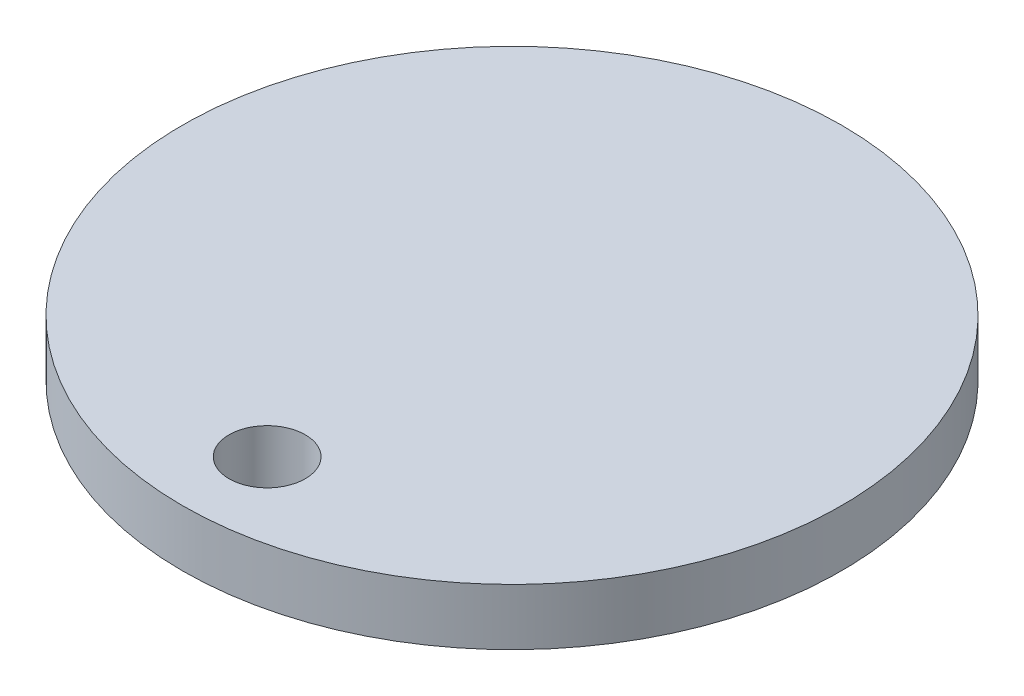
ISO-10303-21;
HEADER;
FILE_DESCRIPTION(('STEP AP214'),'2;1');
FILE_NAME('part.step','',(''),(''),'','','');
FILE_SCHEMA(('AUTOMOTIVE_DESIGN { 1 0 10303 214 1 1 1 1 }'));
ENDSEC;
DATA;
#1=APPLICATION_CONTEXT('core data for automotive mechanical design processes');
#2=APPLICATION_PROTOCOL_DEFINITION('international standard','automotive_design',2000,#1);
#3=PRODUCT_CONTEXT('',#1,'mechanical');
#4=PRODUCT('Part','Part','',(#3));
#5=PRODUCT_RELATED_PRODUCT_CATEGORY('part','',(#4));
#6=PRODUCT_DEFINITION_FORMATION('','',#4);
#7=PRODUCT_DEFINITION_CONTEXT('part definition',#1,'design');
#8=PRODUCT_DEFINITION('design','',#6,#7);
#9=PRODUCT_DEFINITION_SHAPE('','',#8);
#10=(LENGTH_UNIT() NAMED_UNIT(*) SI_UNIT(.MILLI.,.METRE.));
#11=(NAMED_UNIT(*) PLANE_ANGLE_UNIT() SI_UNIT($,.RADIAN.));
#12=(NAMED_UNIT(*) SI_UNIT($,.STERADIAN.) SOLID_ANGLE_UNIT());
#13=UNCERTAINTY_MEASURE_WITH_UNIT(LENGTH_MEASURE(1.E-05),#10,'distance_accuracy_value','');
#14=(GEOMETRIC_REPRESENTATION_CONTEXT(3) GLOBAL_UNCERTAINTY_ASSIGNED_CONTEXT((#13)) GLOBAL_UNIT_ASSIGNED_CONTEXT((#10,
#11,#12)) REPRESENTATION_CONTEXT('',''));
#15=CARTESIAN_POINT('',(0.,0.,0.));
#16=DIRECTION('',(0.,0.,1.));
#17=DIRECTION('',(1.,0.,0.));
#18=AXIS2_PLACEMENT_3D('',#15,#16,#17);
#19=CARTESIAN_POINT('',(0.,3.,0.));
#20=DIRECTION('',(0.,1.,0.));
#21=DIRECTION('',(0.,0.,1.));
#22=AXIS2_PLACEMENT_3D('',#19,#20,#21);
#23=PLANE('',#22);
#24=CARTESIAN_POINT('',(0.,3.,0.));
#25=DIRECTION('',(0.,1.,0.));
#26=DIRECTION('',(0.,0.,1.));
#27=AXIS2_PLACEMENT_3D('',#24,#25,#26);
#28=CIRCLE('',#27,17.5);
#29=CARTESIAN_POINT('',(0.,3.,17.5));
#30=VERTEX_POINT('',#29);
#31=EDGE_CURVE('E10',#30,#30,#28,.T.);
#32=ORIENTED_EDGE('',*,*,#31,.T.);
#33=EDGE_LOOP('',(#32));
#34=FACE_BOUND('',#33,.T.);
#35=CARTESIAN_POINT('',(0.,3.,13.002191226929));
#36=DIRECTION('',(0.,1.,0.));
#37=DIRECTION('',(0.,0.,1.));
#38=AXIS2_PLACEMENT_3D('',#35,#36,#37);
#39=CIRCLE('',#38,2.025);
#40=CARTESIAN_POINT('',(0.,3.,15.027191226929));
#41=VERTEX_POINT('',#40);
#42=EDGE_CURVE('E54',#41,#41,#39,.T.);
#43=ORIENTED_EDGE('',*,*,#42,.F.);
#44=EDGE_LOOP('',(#43));
#45=FACE_BOUND('',#44,.T.);
#46=ADVANCED_FACE('F41',(#34,#45),#23,.T.);
#47=CARTESIAN_POINT('',(0.,0.,0.));
#48=DIRECTION('',(0.,1.,0.));
#49=DIRECTION('',(0.,0.,1.));
#50=AXIS2_PLACEMENT_3D('',#47,#48,#49);
#51=PLANE('',#50);
#52=CARTESIAN_POINT('',(0.,0.,0.));
#53=DIRECTION('',(0.,1.,0.));
#54=DIRECTION('',(0.,0.,1.));
#55=AXIS2_PLACEMENT_3D('',#52,#53,#54);
#56=CIRCLE('',#55,17.5);
#57=CARTESIAN_POINT('',(0.,0.,17.5));
#58=VERTEX_POINT('',#57);
#59=EDGE_CURVE('E45',#58,#58,#56,.T.);
#60=ORIENTED_EDGE('',*,*,#59,.F.);
#61=EDGE_LOOP('',(#60));
#62=FACE_BOUND('',#61,.T.);
#63=CARTESIAN_POINT('',(0.,0.,13.002191226929));
#64=DIRECTION('',(0.,1.,0.));
#65=DIRECTION('',(0.,0.,1.));
#66=AXIS2_PLACEMENT_3D('',#63,#64,#65);
#67=CIRCLE('',#66,2.025);
#68=CARTESIAN_POINT('',(0.,0.,15.027191226929));
#69=VERTEX_POINT('',#68);
#70=EDGE_CURVE('E56',#69,#69,#67,.T.);
#71=ORIENTED_EDGE('',*,*,#70,.T.);
#72=EDGE_LOOP('',(#71));
#73=FACE_BOUND('',#72,.T.);
#74=ADVANCED_FACE('F68',(#62,#73),#51,.F.);
#75=CARTESIAN_POINT('',(0.,3.,0.));
#76=DIRECTION('',(0.,-1.,0.));
#77=DIRECTION('',(0.,0.,-1.));
#78=AXIS2_PLACEMENT_3D('',#75,#76,#77);
#79=CYLINDRICAL_SURFACE('',#78,17.5);
#80=ORIENTED_EDGE('',*,*,#31,.F.);
#81=EDGE_LOOP('',(#80));
#82=FACE_BOUND('',#81,.T.);
#83=ORIENTED_EDGE('',*,*,#59,.T.);
#84=EDGE_LOOP('',(#83));
#85=FACE_BOUND('',#84,.T.);
#86=ADVANCED_FACE('F43',(#82,#85),#79,.T.);
#87=CARTESIAN_POINT('',(0.,3.,13.002191226929));
#88=DIRECTION('',(0.,-1.,0.));
#89=DIRECTION('',(0.,0.,-1.));
#90=AXIS2_PLACEMENT_3D('',#87,#88,#89);
#91=CYLINDRICAL_SURFACE('',#90,2.025);
#92=ORIENTED_EDGE('',*,*,#42,.T.);
#93=EDGE_LOOP('',(#92));
#94=FACE_BOUND('',#93,.T.);
#95=ORIENTED_EDGE('',*,*,#70,.F.);
#96=EDGE_LOOP('',(#95));
#97=FACE_BOUND('',#96,.T.);
#98=ADVANCED_FACE('F64',(#94,#97),#91,.F.);
#99=CLOSED_SHELL('',(#46,#74,#86,#98));
#100=MANIFOLD_SOLID_BREP('B2',#99);
#101=ADVANCED_BREP_SHAPE_REPRESENTATION('',(#18,#100),#14);
#102=SHAPE_DEFINITION_REPRESENTATION(#9,#101);
ENDSEC;
END-ISO-10303-21;
